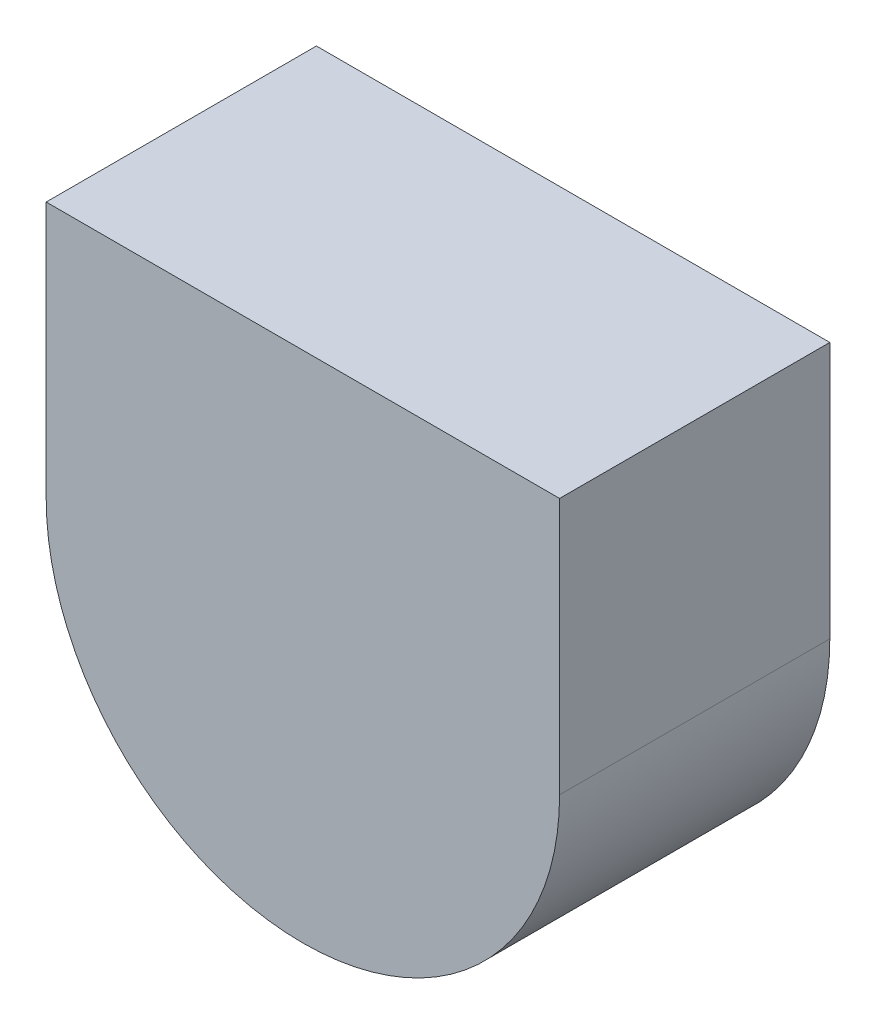
ISO-10303-21;
HEADER;
FILE_DESCRIPTION(('STEP AP214'),'2;1');
FILE_NAME('part.step','',(''),(''),'','','');
FILE_SCHEMA(('AUTOMOTIVE_DESIGN { 1 0 10303 214 1 1 1 1 }'));
ENDSEC;
DATA;
#1=APPLICATION_CONTEXT('core data for automotive mechanical design processes');
#2=APPLICATION_PROTOCOL_DEFINITION('international standard','automotive_design',2000,#1);
#3=PRODUCT_CONTEXT('',#1,'mechanical');
#4=PRODUCT('Part','Part','',(#3));
#5=PRODUCT_RELATED_PRODUCT_CATEGORY('part','',(#4));
#6=PRODUCT_DEFINITION_FORMATION('','',#4);
#7=PRODUCT_DEFINITION_CONTEXT('part definition',#1,'design');
#8=PRODUCT_DEFINITION('design','',#6,#7);
#9=PRODUCT_DEFINITION_SHAPE('','',#8);
#10=(LENGTH_UNIT() NAMED_UNIT(*) SI_UNIT(.MILLI.,.METRE.));
#11=(NAMED_UNIT(*) PLANE_ANGLE_UNIT() SI_UNIT($,.RADIAN.));
#12=(NAMED_UNIT(*) SI_UNIT($,.STERADIAN.) SOLID_ANGLE_UNIT());
#13=UNCERTAINTY_MEASURE_WITH_UNIT(LENGTH_MEASURE(1.E-05),#10,'distance_accuracy_value','');
#14=(GEOMETRIC_REPRESENTATION_CONTEXT(3) GLOBAL_UNCERTAINTY_ASSIGNED_CONTEXT((#13)) GLOBAL_UNIT_ASSIGNED_CONTEXT((#10,
#11,#12)) REPRESENTATION_CONTEXT('',''));
#15=CARTESIAN_POINT('',(0.,0.,0.));
#16=DIRECTION('',(0.,0.,1.));
#17=DIRECTION('',(1.,0.,0.));
#18=AXIS2_PLACEMENT_3D('',#15,#16,#17);
#19=CARTESIAN_POINT('',(0.,0.,20.));
#20=DIRECTION('',(0.,0.,-1.));
#21=DIRECTION('',(-1.,0.,0.));
#22=AXIS2_PLACEMENT_3D('',#19,#20,#21);
#23=CYLINDRICAL_SURFACE('',#22,19.);
#24=CARTESIAN_POINT('',(0.,0.,0.));
#25=DIRECTION('',(0.,0.,1.));
#26=DIRECTION('',(1.,0.,0.));
#27=AXIS2_PLACEMENT_3D('',#24,#25,#26);
#28=CIRCLE('',#27,19.);
#29=CARTESIAN_POINT('',(-19.,0.,0.));
#30=VERTEX_POINT('',#29);
#31=CARTESIAN_POINT('',(19.,0.,0.));
#32=VERTEX_POINT('',#31);
#33=EDGE_CURVE('E96',#30,#32,#28,.T.);
#34=ORIENTED_EDGE('',*,*,#33,.T.);
#35=DIRECTION('',(0.,0.,-1.));
#36=VECTOR('',#35,1.);
#37=CARTESIAN_POINT('',(19.,0.,20.));
#38=LINE('',#37,#36);
#39=CARTESIAN_POINT('',(19.,0.,20.));
#40=VERTEX_POINT('',#39);
#41=EDGE_CURVE('E11',#40,#32,#38,.T.);
#42=ORIENTED_EDGE('',*,*,#41,.F.);
#43=CARTESIAN_POINT('',(0.,0.,20.));
#44=DIRECTION('',(0.,0.,1.));
#45=DIRECTION('',(1.,0.,0.));
#46=AXIS2_PLACEMENT_3D('',#43,#44,#45);
#47=CIRCLE('',#46,19.);
#48=CARTESIAN_POINT('',(-19.,0.,20.));
#49=VERTEX_POINT('',#48);
#50=EDGE_CURVE('E82',#49,#40,#47,.T.);
#51=ORIENTED_EDGE('',*,*,#50,.F.);
#52=DIRECTION('',(0.,0.,-1.));
#53=VECTOR('',#52,1.);
#54=CARTESIAN_POINT('',(-19.,0.,20.));
#55=LINE('',#54,#53);
#56=EDGE_CURVE('E49',#49,#30,#55,.T.);
#57=ORIENTED_EDGE('',*,*,#56,.T.);
#58=EDGE_LOOP('',(#34,#42,#51,#57));
#59=FACE_BOUND('',#58,.T.);
#60=ADVANCED_FACE('F33',(#59),#23,.T.);
#61=CARTESIAN_POINT('',(19.,0.,20.));
#62=DIRECTION('',(-1.,0.,0.));
#63=DIRECTION('',(0.,0.,1.));
#64=AXIS2_PLACEMENT_3D('',#61,#62,#63);
#65=PLANE('',#64);
#66=DIRECTION('',(0.,1.,0.));
#67=VECTOR('',#66,1.);
#68=CARTESIAN_POINT('',(19.,0.,0.));
#69=LINE('',#68,#67);
#70=CARTESIAN_POINT('',(19.,19.,0.));
#71=VERTEX_POINT('',#70);
#72=EDGE_CURVE('E87',#32,#71,#69,.T.);
#73=ORIENTED_EDGE('',*,*,#72,.T.);
#74=DIRECTION('',(0.,0.,-1.));
#75=VECTOR('',#74,1.);
#76=CARTESIAN_POINT('',(19.,19.,20.));
#77=LINE('',#76,#75);
#78=CARTESIAN_POINT('',(19.,19.,20.));
#79=VERTEX_POINT('',#78);
#80=EDGE_CURVE('E41',#79,#71,#77,.T.);
#81=ORIENTED_EDGE('',*,*,#80,.F.);
#82=DIRECTION('',(0.,1.,0.));
#83=VECTOR('',#82,1.);
#84=CARTESIAN_POINT('',(19.,0.,20.));
#85=LINE('',#84,#83);
#86=EDGE_CURVE('E74',#40,#79,#85,.T.);
#87=ORIENTED_EDGE('',*,*,#86,.F.);
#88=ORIENTED_EDGE('',*,*,#41,.T.);
#89=EDGE_LOOP('',(#73,#81,#87,#88));
#90=FACE_BOUND('',#89,.T.);
#91=ADVANCED_FACE('F86',(#90),#65,.F.);
#92=CARTESIAN_POINT('',(-19.,19.,20.));
#93=DIRECTION('',(0.,1.,0.));
#94=DIRECTION('',(0.,0.,1.));
#95=AXIS2_PLACEMENT_3D('',#92,#93,#94);
#96=PLANE('',#95);
#97=DIRECTION('',(1.,0.,0.));
#98=VECTOR('',#97,1.);
#99=CARTESIAN_POINT('',(-19.,19.,0.));
#100=LINE('',#99,#98);
#101=CARTESIAN_POINT('',(-19.,19.,0.));
#102=VERTEX_POINT('',#101);
#103=EDGE_CURVE('E99',#102,#71,#100,.T.);
#104=ORIENTED_EDGE('',*,*,#103,.F.);
#105=DIRECTION('',(0.,0.,-1.));
#106=VECTOR('',#105,1.);
#107=CARTESIAN_POINT('',(-19.,19.,20.));
#108=LINE('',#107,#106);
#109=CARTESIAN_POINT('',(-19.,19.,20.));
#110=VERTEX_POINT('',#109);
#111=EDGE_CURVE('E63',#110,#102,#108,.T.);
#112=ORIENTED_EDGE('',*,*,#111,.F.);
#113=DIRECTION('',(1.,0.,0.));
#114=VECTOR('',#113,1.);
#115=CARTESIAN_POINT('',(-19.,19.,20.));
#116=LINE('',#115,#114);
#117=EDGE_CURVE('E81',#110,#79,#116,.T.);
#118=ORIENTED_EDGE('',*,*,#117,.T.);
#119=ORIENTED_EDGE('',*,*,#80,.T.);
#120=EDGE_LOOP('',(#104,#112,#118,#119));
#121=FACE_BOUND('',#120,.T.);
#122=ADVANCED_FACE('F90',(#121),#96,.T.);
#123=CARTESIAN_POINT('',(-19.,0.,20.));
#124=DIRECTION('',(-1.,0.,0.));
#125=DIRECTION('',(0.,0.,1.));
#126=AXIS2_PLACEMENT_3D('',#123,#124,#125);
#127=PLANE('',#126);
#128=DIRECTION('',(0.,1.,0.));
#129=VECTOR('',#128,1.);
#130=CARTESIAN_POINT('',(-19.,0.,0.));
#131=LINE('',#130,#129);
#132=EDGE_CURVE('E101',#30,#102,#131,.T.);
#133=ORIENTED_EDGE('',*,*,#132,.F.);
#134=ORIENTED_EDGE('',*,*,#56,.F.);
#135=DIRECTION('',(0.,1.,0.));
#136=VECTOR('',#135,1.);
#137=CARTESIAN_POINT('',(-19.,0.,20.));
#138=LINE('',#137,#136);
#139=EDGE_CURVE('E91',#49,#110,#138,.T.);
#140=ORIENTED_EDGE('',*,*,#139,.T.);
#141=ORIENTED_EDGE('',*,*,#111,.T.);
#142=EDGE_LOOP('',(#133,#134,#140,#141));
#143=FACE_BOUND('',#142,.T.);
#144=ADVANCED_FACE('F107',(#143),#127,.T.);
#145=CARTESIAN_POINT('',(0.,0.,20.));
#146=DIRECTION('',(0.,0.,1.));
#147=DIRECTION('',(1.,0.,0.));
#148=AXIS2_PLACEMENT_3D('',#145,#146,#147);
#149=PLANE('',#148);
#150=ORIENTED_EDGE('',*,*,#50,.T.);
#151=ORIENTED_EDGE('',*,*,#86,.T.);
#152=ORIENTED_EDGE('',*,*,#117,.F.);
#153=ORIENTED_EDGE('',*,*,#139,.F.);
#154=EDGE_LOOP('',(#150,#151,#152,#153));
#155=FACE_BOUND('',#154,.T.);
#156=ADVANCED_FACE('F78',(#155),#149,.T.);
#157=CARTESIAN_POINT('',(0.,0.,0.));
#158=DIRECTION('',(0.,0.,1.));
#159=DIRECTION('',(1.,0.,0.));
#160=AXIS2_PLACEMENT_3D('',#157,#158,#159);
#161=PLANE('',#160);
#162=ORIENTED_EDGE('',*,*,#33,.F.);
#163=ORIENTED_EDGE('',*,*,#132,.T.);
#164=ORIENTED_EDGE('',*,*,#103,.T.);
#165=ORIENTED_EDGE('',*,*,#72,.F.);
#166=EDGE_LOOP('',(#162,#163,#164,#165));
#167=FACE_BOUND('',#166,.T.);
#168=ADVANCED_FACE('F106',(#167),#161,.F.);
#169=CLOSED_SHELL('',(#60,#91,#122,#144,#156,#168));
#170=MANIFOLD_SOLID_BREP('B2',#169);
#171=ADVANCED_BREP_SHAPE_REPRESENTATION('',(#18,#170),#14);
#172=SHAPE_DEFINITION_REPRESENTATION(#9,#171);
ENDSEC;
END-ISO-10303-21;
